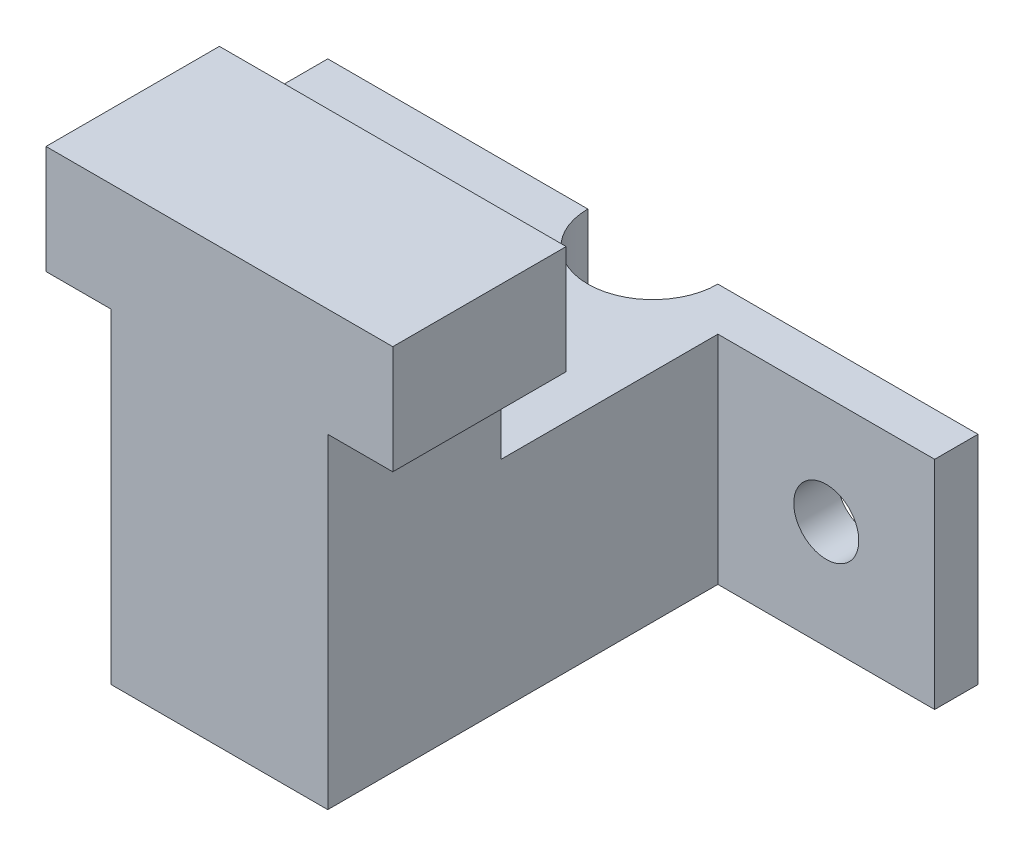
ISO-10303-21;
HEADER;
FILE_DESCRIPTION(('STEP AP214'),'2;1');
FILE_NAME('part.step','',(''),(''),'','','');
FILE_SCHEMA(('AUTOMOTIVE_DESIGN { 1 0 10303 214 1 1 1 1 }'));
ENDSEC;
DATA;
#1=APPLICATION_CONTEXT('core data for automotive mechanical design processes');
#2=APPLICATION_PROTOCOL_DEFINITION('international standard','automotive_design',2000,#1);
#3=PRODUCT_CONTEXT('',#1,'mechanical');
#4=PRODUCT('Part','Part','',(#3));
#5=PRODUCT_RELATED_PRODUCT_CATEGORY('part','',(#4));
#6=PRODUCT_DEFINITION_FORMATION('','',#4);
#7=PRODUCT_DEFINITION_CONTEXT('part definition',#1,'design');
#8=PRODUCT_DEFINITION('design','',#6,#7);
#9=PRODUCT_DEFINITION_SHAPE('','',#8);
#10=(LENGTH_UNIT() NAMED_UNIT(*) SI_UNIT(.MILLI.,.METRE.));
#11=(NAMED_UNIT(*) PLANE_ANGLE_UNIT() SI_UNIT($,.RADIAN.));
#12=(NAMED_UNIT(*) SI_UNIT($,.STERADIAN.) SOLID_ANGLE_UNIT());
#13=UNCERTAINTY_MEASURE_WITH_UNIT(LENGTH_MEASURE(1.E-05),#10,'distance_accuracy_value','');
#14=(GEOMETRIC_REPRESENTATION_CONTEXT(3) GLOBAL_UNCERTAINTY_ASSIGNED_CONTEXT((#13)) GLOBAL_UNIT_ASSIGNED_CONTEXT((#10,
#11,#12)) REPRESENTATION_CONTEXT('',''));
#15=CARTESIAN_POINT('',(0.,0.,0.));
#16=DIRECTION('',(0.,0.,1.));
#17=DIRECTION('',(1.,0.,0.));
#18=AXIS2_PLACEMENT_3D('',#15,#16,#17);
#19=CARTESIAN_POINT('',(-5.,-10.,0.));
#20=DIRECTION('',(1.,0.,0.));
#21=DIRECTION('',(0.,0.,-1.));
#22=AXIS2_PLACEMENT_3D('',#19,#20,#21);
#23=PLANE('',#22);
#24=DIRECTION('',(0.,1.,0.));
#25=VECTOR('',#24,1.);
#26=CARTESIAN_POINT('',(-5.,-10.,-10.));
#27=LINE('',#26,#25);
#28=CARTESIAN_POINT('',(-5.,-10.,-10.));
#29=VERTEX_POINT('',#28);
#30=CARTESIAN_POINT('',(-5.,0.,-10.));
#31=VERTEX_POINT('',#30);
#32=EDGE_CURVE('E173',#29,#31,#27,.T.);
#33=ORIENTED_EDGE('',*,*,#32,.F.);
#34=DIRECTION('',(0.,0.,1.));
#35=VECTOR('',#34,1.);
#36=CARTESIAN_POINT('',(-5.,-10.,0.));
#37=LINE('',#36,#35);
#38=CARTESIAN_POINT('',(-5.,-10.,8.));
#39=VERTEX_POINT('',#38);
#40=EDGE_CURVE('E225',#29,#39,#37,.T.);
#41=ORIENTED_EDGE('',*,*,#40,.T.);
#42=DIRECTION('',(0.,1.,0.));
#43=VECTOR('',#42,1.);
#44=CARTESIAN_POINT('',(-5.,-10.,8.));
#45=LINE('',#44,#43);
#46=CARTESIAN_POINT('',(-5.,5.,8.));
#47=VERTEX_POINT('',#46);
#48=EDGE_CURVE('E226',#39,#47,#45,.T.);
#49=ORIENTED_EDGE('',*,*,#48,.T.);
#50=DIRECTION('',(0.,0.,1.));
#51=VECTOR('',#50,1.);
#52=CARTESIAN_POINT('',(-5.,5.,0.));
#53=LINE('',#52,#51);
#54=CARTESIAN_POINT('',(-5.,5.,0.));
#55=VERTEX_POINT('',#54);
#56=EDGE_CURVE('E234',#55,#47,#53,.T.);
#57=ORIENTED_EDGE('',*,*,#56,.F.);
#58=DIRECTION('',(0.,1.,0.));
#59=VECTOR('',#58,1.);
#60=CARTESIAN_POINT('',(-5.,-10.,0.));
#61=LINE('',#60,#59);
#62=CARTESIAN_POINT('',(-5.,0.,0.));
#63=VERTEX_POINT('',#62);
#64=EDGE_CURVE('E219',#63,#55,#61,.T.);
#65=ORIENTED_EDGE('',*,*,#64,.F.);
#66=DIRECTION('',(0.,0.,1.));
#67=VECTOR('',#66,1.);
#68=CARTESIAN_POINT('',(-5.,0.,-12.));
#69=LINE('',#68,#67);
#70=EDGE_CURVE('E216',#31,#63,#69,.T.);
#71=ORIENTED_EDGE('',*,*,#70,.F.);
#72=EDGE_LOOP('',(#33,#41,#49,#57,#65,#71));
#73=FACE_BOUND('',#72,.T.);
#74=ADVANCED_FACE('F35',(#73),#23,.F.);
#75=CARTESIAN_POINT('',(5.,-10.,0.));
#76=DIRECTION('',(-1.,0.,0.));
#77=DIRECTION('',(0.,0.,1.));
#78=AXIS2_PLACEMENT_3D('',#75,#76,#77);
#79=PLANE('',#78);
#80=DIRECTION('',(0.,-1.,0.));
#81=VECTOR('',#80,1.);
#82=CARTESIAN_POINT('',(5.,-10.,-10.));
#83=LINE('',#82,#81);
#84=CARTESIAN_POINT('',(5.,0.,-10.));
#85=VERTEX_POINT('',#84);
#86=CARTESIAN_POINT('',(5.,-10.,-10.));
#87=VERTEX_POINT('',#86);
#88=EDGE_CURVE('E186',#85,#87,#83,.T.);
#89=ORIENTED_EDGE('',*,*,#88,.F.);
#90=DIRECTION('',(0.,0.,1.));
#91=VECTOR('',#90,1.);
#92=CARTESIAN_POINT('',(5.,0.,-12.));
#93=LINE('',#92,#91);
#94=CARTESIAN_POINT('',(5.,0.,0.));
#95=VERTEX_POINT('',#94);
#96=EDGE_CURVE('E212',#85,#95,#93,.T.);
#97=ORIENTED_EDGE('',*,*,#96,.T.);
#98=DIRECTION('',(0.,-1.,0.));
#99=VECTOR('',#98,1.);
#100=CARTESIAN_POINT('',(5.,-10.,0.));
#101=LINE('',#100,#99);
#102=CARTESIAN_POINT('',(5.,5.,0.));
#103=VERTEX_POINT('',#102);
#104=EDGE_CURVE('E240',#103,#95,#101,.T.);
#105=ORIENTED_EDGE('',*,*,#104,.F.);
#106=DIRECTION('',(0.,0.,1.));
#107=VECTOR('',#106,1.);
#108=CARTESIAN_POINT('',(5.,5.,0.));
#109=LINE('',#108,#107);
#110=CARTESIAN_POINT('',(5.,5.,8.));
#111=VERTEX_POINT('',#110);
#112=EDGE_CURVE('E249',#103,#111,#109,.T.);
#113=ORIENTED_EDGE('',*,*,#112,.T.);
#114=DIRECTION('',(0.,-1.,0.));
#115=VECTOR('',#114,1.);
#116=CARTESIAN_POINT('',(5.,-10.,8.));
#117=LINE('',#116,#115);
#118=CARTESIAN_POINT('',(5.,-10.,8.));
#119=VERTEX_POINT('',#118);
#120=EDGE_CURVE('E241',#111,#119,#117,.T.);
#121=ORIENTED_EDGE('',*,*,#120,.T.);
#122=DIRECTION('',(0.,0.,1.));
#123=VECTOR('',#122,1.);
#124=CARTESIAN_POINT('',(5.,-10.,0.));
#125=LINE('',#124,#123);
#126=EDGE_CURVE('E52',#87,#119,#125,.T.);
#127=ORIENTED_EDGE('',*,*,#126,.F.);
#128=EDGE_LOOP('',(#89,#97,#105,#113,#121,#127));
#129=FACE_BOUND('',#128,.T.);
#130=ADVANCED_FACE('F304',(#129),#79,.F.);
#131=CARTESIAN_POINT('',(0.,0.,-12.));
#132=DIRECTION('',(0.,0.,-1.));
#133=DIRECTION('',(-1.,0.,0.));
#134=AXIS2_PLACEMENT_3D('',#131,#132,#133);
#135=PLANE('',#134);
#136=CARTESIAN_POINT('',(10.,-5.,-12.));
#137=DIRECTION('',(0.,0.,-1.));
#138=DIRECTION('',(-1.,0.,0.));
#139=AXIS2_PLACEMENT_3D('',#136,#137,#138);
#140=CIRCLE('',#139,1.5);
#141=CARTESIAN_POINT('',(8.5,-5.,-12.));
#142=VERTEX_POINT('',#141);
#143=EDGE_CURVE('E276',#142,#142,#140,.T.);
#144=ORIENTED_EDGE('',*,*,#143,.F.);
#145=EDGE_LOOP('',(#144));
#146=FACE_BOUND('',#145,.T.);
#147=DIRECTION('',(0.,-1.,0.));
#148=VECTOR('',#147,1.);
#149=CARTESIAN_POINT('',(3.,4.,-12.));
#150=LINE('',#149,#148);
#151=CARTESIAN_POINT('',(3.,0.,-12.));
#152=VERTEX_POINT('',#151);
#153=CARTESIAN_POINT('',(3.,-10.,-12.));
#154=VERTEX_POINT('',#153);
#155=EDGE_CURVE('E11',#152,#154,#150,.T.);
#156=ORIENTED_EDGE('',*,*,#155,.F.);
#157=DIRECTION('',(1.,0.,0.));
#158=VECTOR('',#157,1.);
#159=CARTESIAN_POINT('',(-5.,0.,-12.));
#160=LINE('',#159,#158);
#161=CARTESIAN_POINT('',(15.,0.,-12.));
#162=VERTEX_POINT('',#161);
#163=EDGE_CURVE('E209',#152,#162,#160,.T.);
#164=ORIENTED_EDGE('',*,*,#163,.T.);
#165=DIRECTION('',(0.,1.,0.));
#166=VECTOR('',#165,1.);
#167=CARTESIAN_POINT('',(15.,-10.,-12.));
#168=LINE('',#167,#166);
#169=CARTESIAN_POINT('',(15.,-10.,-12.));
#170=VERTEX_POINT('',#169);
#171=EDGE_CURVE('E187',#170,#162,#168,.T.);
#172=ORIENTED_EDGE('',*,*,#171,.F.);
#173=DIRECTION('',(-1.,0.,0.));
#174=VECTOR('',#173,1.);
#175=CARTESIAN_POINT('',(-5.,-10.,-12.));
#176=LINE('',#175,#174);
#177=EDGE_CURVE('E157',#170,#154,#176,.T.);
#178=ORIENTED_EDGE('',*,*,#177,.T.);
#179=EDGE_LOOP('',(#156,#164,#172,#178));
#180=FACE_BOUND('',#179,.T.);
#181=ADVANCED_FACE('F293',(#146,#180),#135,.T.);
#182=CARTESIAN_POINT('',(8.,-10.,8.));
#183=DIRECTION('',(-1.,0.,0.));
#184=DIRECTION('',(0.,0.,1.));
#185=AXIS2_PLACEMENT_3D('',#182,#183,#184);
#186=PLANE('',#185);
#187=DIRECTION('',(0.,1.,0.));
#188=VECTOR('',#187,1.);
#189=CARTESIAN_POINT('',(8.,-10.,8.));
#190=LINE('',#189,#188);
#191=CARTESIAN_POINT('',(8.,5.,8.));
#192=VERTEX_POINT('',#191);
#193=CARTESIAN_POINT('',(8.,10.,8.));
#194=VERTEX_POINT('',#193);
#195=EDGE_CURVE('E252',#192,#194,#190,.T.);
#196=ORIENTED_EDGE('',*,*,#195,.F.);
#197=DIRECTION('',(0.,0.,1.));
#198=VECTOR('',#197,1.);
#199=CARTESIAN_POINT('',(8.,5.,0.));
#200=LINE('',#199,#198);
#201=CARTESIAN_POINT('',(8.,5.,0.));
#202=VERTEX_POINT('',#201);
#203=EDGE_CURVE('E244',#202,#192,#200,.T.);
#204=ORIENTED_EDGE('',*,*,#203,.F.);
#205=DIRECTION('',(0.,1.,0.));
#206=VECTOR('',#205,1.);
#207=CARTESIAN_POINT('',(8.,-10.,0.));
#208=LINE('',#207,#206);
#209=CARTESIAN_POINT('',(8.,10.,0.));
#210=VERTEX_POINT('',#209);
#211=EDGE_CURVE('E233',#202,#210,#208,.T.);
#212=ORIENTED_EDGE('',*,*,#211,.T.);
#213=DIRECTION('',(0.,0.,-1.));
#214=VECTOR('',#213,1.);
#215=CARTESIAN_POINT('',(8.,10.,8.));
#216=LINE('',#215,#214);
#217=EDGE_CURVE('E271',#194,#210,#216,.T.);
#218=ORIENTED_EDGE('',*,*,#217,.F.);
#219=EDGE_LOOP('',(#196,#204,#212,#218));
#220=FACE_BOUND('',#219,.T.);
#221=ADVANCED_FACE('F37',(#220),#186,.F.);
#222=CARTESIAN_POINT('',(-8.,10.,8.));
#223=DIRECTION('',(0.,-1.,0.));
#224=DIRECTION('',(0.,0.,-1.));
#225=AXIS2_PLACEMENT_3D('',#222,#223,#224);
#226=PLANE('',#225);
#227=DIRECTION('',(-1.,0.,0.));
#228=VECTOR('',#227,1.);
#229=CARTESIAN_POINT('',(-8.,10.,0.));
#230=LINE('',#229,#228);
#231=CARTESIAN_POINT('',(-8.,10.,0.));
#232=VERTEX_POINT('',#231);
#233=EDGE_CURVE('E265',#210,#232,#230,.T.);
#234=ORIENTED_EDGE('',*,*,#233,.T.);
#235=DIRECTION('',(0.,0.,-1.));
#236=VECTOR('',#235,1.);
#237=CARTESIAN_POINT('',(-8.,10.,8.));
#238=LINE('',#237,#236);
#239=CARTESIAN_POINT('',(-8.,10.,8.));
#240=VERTEX_POINT('',#239);
#241=EDGE_CURVE('E263',#240,#232,#238,.T.);
#242=ORIENTED_EDGE('',*,*,#241,.F.);
#243=DIRECTION('',(-1.,0.,0.));
#244=VECTOR('',#243,1.);
#245=CARTESIAN_POINT('',(-8.,10.,8.));
#246=LINE('',#245,#244);
#247=EDGE_CURVE('E254',#194,#240,#246,.T.);
#248=ORIENTED_EDGE('',*,*,#247,.F.);
#249=ORIENTED_EDGE('',*,*,#217,.T.);
#250=EDGE_LOOP('',(#234,#242,#248,#249));
#251=FACE_BOUND('',#250,.T.);
#252=ADVANCED_FACE('F332',(#251),#226,.F.);
#253=CARTESIAN_POINT('',(-8.,-10.,8.));
#254=DIRECTION('',(1.,0.,0.));
#255=DIRECTION('',(0.,0.,-1.));
#256=AXIS2_PLACEMENT_3D('',#253,#254,#255);
#257=PLANE('',#256);
#258=DIRECTION('',(0.,-1.,0.));
#259=VECTOR('',#258,1.);
#260=CARTESIAN_POINT('',(-8.,-10.,0.));
#261=LINE('',#260,#259);
#262=CARTESIAN_POINT('',(-8.,5.,0.));
#263=VERTEX_POINT('',#262);
#264=EDGE_CURVE('E255',#232,#263,#261,.T.);
#265=ORIENTED_EDGE('',*,*,#264,.T.);
#266=DIRECTION('',(0.,0.,1.));
#267=VECTOR('',#266,1.);
#268=CARTESIAN_POINT('',(-8.,5.,0.));
#269=LINE('',#268,#267);
#270=CARTESIAN_POINT('',(-8.,5.,8.));
#271=VERTEX_POINT('',#270);
#272=EDGE_CURVE('E230',#263,#271,#269,.T.);
#273=ORIENTED_EDGE('',*,*,#272,.T.);
#274=DIRECTION('',(0.,-1.,0.));
#275=VECTOR('',#274,1.);
#276=CARTESIAN_POINT('',(-8.,-10.,8.));
#277=LINE('',#276,#275);
#278=EDGE_CURVE('E257',#240,#271,#277,.T.);
#279=ORIENTED_EDGE('',*,*,#278,.F.);
#280=ORIENTED_EDGE('',*,*,#241,.T.);
#281=EDGE_LOOP('',(#265,#273,#279,#280));
#282=FACE_BOUND('',#281,.T.);
#283=ADVANCED_FACE('F330',(#282),#257,.F.);
#284=CARTESIAN_POINT('',(-8.,-10.,8.));
#285=DIRECTION('',(0.,1.,0.));
#286=DIRECTION('',(0.,0.,1.));
#287=AXIS2_PLACEMENT_3D('',#284,#285,#286);
#288=PLANE('',#287);
#289=CARTESIAN_POINT('',(-3.,-10.,-12.));
#290=VERTEX_POINT('',#289);
#291=CARTESIAN_POINT('',(-15.,-10.,-12.));
#292=VERTEX_POINT('',#291);
#293=EDGE_CURVE('E150',#290,#292,#176,.T.);
#294=ORIENTED_EDGE('',*,*,#293,.F.);
#295=CARTESIAN_POINT('',(0.,-10.,-12.));
#296=DIRECTION('',(0.,-1.,0.));
#297=DIRECTION('',(0.,0.,-1.));
#298=AXIS2_PLACEMENT_3D('',#295,#296,#297);
#299=CIRCLE('',#298,3.);
#300=EDGE_CURVE('E59',#154,#290,#299,.T.);
#301=ORIENTED_EDGE('',*,*,#300,.F.);
#302=ORIENTED_EDGE('',*,*,#177,.F.);
#303=DIRECTION('',(0.,0.,-1.));
#304=VECTOR('',#303,1.);
#305=CARTESIAN_POINT('',(15.,-10.,-12.));
#306=LINE('',#305,#304);
#307=CARTESIAN_POINT('',(15.,-10.,-10.));
#308=VERTEX_POINT('',#307);
#309=EDGE_CURVE('E194',#308,#170,#306,.T.);
#310=ORIENTED_EDGE('',*,*,#309,.F.);
#311=DIRECTION('',(-1.,0.,0.));
#312=VECTOR('',#311,1.);
#313=CARTESIAN_POINT('',(15.,-10.,-10.));
#314=LINE('',#313,#312);
#315=EDGE_CURVE('E197',#308,#87,#314,.T.);
#316=ORIENTED_EDGE('',*,*,#315,.T.);
#317=ORIENTED_EDGE('',*,*,#126,.T.);
#318=DIRECTION('',(1.,0.,0.));
#319=VECTOR('',#318,1.);
#320=CARTESIAN_POINT('',(-8.,-10.,8.));
#321=LINE('',#320,#319);
#322=EDGE_CURVE('E260',#39,#119,#321,.T.);
#323=ORIENTED_EDGE('',*,*,#322,.F.);
#324=ORIENTED_EDGE('',*,*,#40,.F.);
#325=DIRECTION('',(1.,0.,0.));
#326=VECTOR('',#325,1.);
#327=CARTESIAN_POINT('',(-15.,-10.,-10.));
#328=LINE('',#327,#326);
#329=CARTESIAN_POINT('',(-15.,-10.,-10.));
#330=VERTEX_POINT('',#329);
#331=EDGE_CURVE('E164',#330,#29,#328,.T.);
#332=ORIENTED_EDGE('',*,*,#331,.F.);
#333=DIRECTION('',(0.,0.,1.));
#334=VECTOR('',#333,1.);
#335=CARTESIAN_POINT('',(-15.,-10.,-12.));
#336=LINE('',#335,#334);
#337=EDGE_CURVE('E161',#292,#330,#336,.T.);
#338=ORIENTED_EDGE('',*,*,#337,.F.);
#339=EDGE_LOOP('',(#294,#301,#302,#310,#316,#317,#323,#324,#332,#338));
#340=FACE_BOUND('',#339,.T.);
#341=ADVANCED_FACE('F162',(#340),#288,.F.);
#342=CARTESIAN_POINT('',(0.,0.,8.));
#343=DIRECTION('',(0.,0.,-1.));
#344=DIRECTION('',(-1.,0.,0.));
#345=AXIS2_PLACEMENT_3D('',#342,#343,#344);
#346=PLANE('',#345);
#347=ORIENTED_EDGE('',*,*,#278,.T.);
#348=DIRECTION('',(-1.,0.,0.));
#349=VECTOR('',#348,1.);
#350=CARTESIAN_POINT('',(-8.,5.,8.));
#351=LINE('',#350,#349);
#352=EDGE_CURVE('E222',#47,#271,#351,.T.);
#353=ORIENTED_EDGE('',*,*,#352,.F.);
#354=ORIENTED_EDGE('',*,*,#48,.F.);
#355=ORIENTED_EDGE('',*,*,#322,.T.);
#356=ORIENTED_EDGE('',*,*,#120,.F.);
#357=DIRECTION('',(-1.,0.,0.));
#358=VECTOR('',#357,1.);
#359=CARTESIAN_POINT('',(8.,5.,8.));
#360=LINE('',#359,#358);
#361=EDGE_CURVE('E218',#192,#111,#360,.T.);
#362=ORIENTED_EDGE('',*,*,#361,.F.);
#363=ORIENTED_EDGE('',*,*,#195,.T.);
#364=ORIENTED_EDGE('',*,*,#247,.T.);
#365=EDGE_LOOP('',(#347,#353,#354,#355,#356,#362,#363,#364));
#366=FACE_BOUND('',#365,.T.);
#367=ADVANCED_FACE('F321',(#366),#346,.F.);
#368=CARTESIAN_POINT('',(0.,0.,0.));
#369=DIRECTION('',(0.,0.,-1.));
#370=DIRECTION('',(-1.,0.,0.));
#371=AXIS2_PLACEMENT_3D('',#368,#369,#370);
#372=PLANE('',#371);
#373=DIRECTION('',(1.,0.,0.));
#374=VECTOR('',#373,1.);
#375=CARTESIAN_POINT('',(-5.,0.,0.));
#376=LINE('',#375,#374);
#377=EDGE_CURVE('E208',#63,#95,#376,.T.);
#378=ORIENTED_EDGE('',*,*,#377,.F.);
#379=ORIENTED_EDGE('',*,*,#64,.T.);
#380=DIRECTION('',(-1.,0.,0.));
#381=VECTOR('',#380,1.);
#382=CARTESIAN_POINT('',(-8.,5.,0.));
#383=LINE('',#382,#381);
#384=EDGE_CURVE('E221',#55,#263,#383,.T.);
#385=ORIENTED_EDGE('',*,*,#384,.T.);
#386=ORIENTED_EDGE('',*,*,#264,.F.);
#387=ORIENTED_EDGE('',*,*,#233,.F.);
#388=ORIENTED_EDGE('',*,*,#211,.F.);
#389=DIRECTION('',(-1.,0.,0.));
#390=VECTOR('',#389,1.);
#391=CARTESIAN_POINT('',(8.,5.,0.));
#392=LINE('',#391,#390);
#393=EDGE_CURVE('E237',#202,#103,#392,.T.);
#394=ORIENTED_EDGE('',*,*,#393,.T.);
#395=ORIENTED_EDGE('',*,*,#104,.T.);
#396=EDGE_LOOP('',(#378,#379,#385,#386,#387,#388,#394,#395));
#397=FACE_BOUND('',#396,.T.);
#398=ADVANCED_FACE('F319',(#397),#372,.T.);
#399=CARTESIAN_POINT('',(8.,5.,0.));
#400=DIRECTION('',(0.,1.,0.));
#401=DIRECTION('',(0.,0.,1.));
#402=AXIS2_PLACEMENT_3D('',#399,#400,#401);
#403=PLANE('',#402);
#404=ORIENTED_EDGE('',*,*,#361,.T.);
#405=ORIENTED_EDGE('',*,*,#112,.F.);
#406=ORIENTED_EDGE('',*,*,#393,.F.);
#407=ORIENTED_EDGE('',*,*,#203,.T.);
#408=EDGE_LOOP('',(#404,#405,#406,#407));
#409=FACE_BOUND('',#408,.T.);
#410=ADVANCED_FACE('F316',(#409),#403,.F.);
#411=CARTESIAN_POINT('',(-8.,5.,0.));
#412=DIRECTION('',(0.,1.,0.));
#413=DIRECTION('',(0.,0.,1.));
#414=AXIS2_PLACEMENT_3D('',#411,#412,#413);
#415=PLANE('',#414);
#416=ORIENTED_EDGE('',*,*,#352,.T.);
#417=ORIENTED_EDGE('',*,*,#272,.F.);
#418=ORIENTED_EDGE('',*,*,#384,.F.);
#419=ORIENTED_EDGE('',*,*,#56,.T.);
#420=EDGE_LOOP('',(#416,#417,#418,#419));
#421=FACE_BOUND('',#420,.T.);
#422=ADVANCED_FACE('F300',(#421),#415,.F.);
#423=CARTESIAN_POINT('',(-5.,0.,-12.));
#424=DIRECTION('',(0.,-1.,0.));
#425=DIRECTION('',(1.,0.,0.));
#426=AXIS2_PLACEMENT_3D('',#423,#424,#425);
#427=PLANE('',#426);
#428=ORIENTED_EDGE('',*,*,#163,.F.);
#429=CARTESIAN_POINT('',(0.,0.,-12.));
#430=DIRECTION('',(0.,-1.,0.));
#431=DIRECTION('',(1.,0.,0.));
#432=AXIS2_PLACEMENT_3D('',#429,#430,#431);
#433=CIRCLE('',#432,3.);
#434=CARTESIAN_POINT('',(-3.,0.,-12.));
#435=VERTEX_POINT('',#434);
#436=EDGE_CURVE('E205',#152,#435,#433,.T.);
#437=ORIENTED_EDGE('',*,*,#436,.T.);
#438=CARTESIAN_POINT('',(-15.,0.,-12.));
#439=VERTEX_POINT('',#438);
#440=EDGE_CURVE('E158',#439,#435,#160,.T.);
#441=ORIENTED_EDGE('',*,*,#440,.F.);
#442=DIRECTION('',(0.,0.,-1.));
#443=VECTOR('',#442,1.);
#444=CARTESIAN_POINT('',(-15.,0.,-12.));
#445=LINE('',#444,#443);
#446=CARTESIAN_POINT('',(-15.,0.,-10.));
#447=VERTEX_POINT('',#446);
#448=EDGE_CURVE('E172',#447,#439,#445,.T.);
#449=ORIENTED_EDGE('',*,*,#448,.F.);
#450=DIRECTION('',(1.,0.,0.));
#451=VECTOR('',#450,1.);
#452=CARTESIAN_POINT('',(-15.,0.,-10.));
#453=LINE('',#452,#451);
#454=EDGE_CURVE('E181',#447,#31,#453,.T.);
#455=ORIENTED_EDGE('',*,*,#454,.T.);
#456=ORIENTED_EDGE('',*,*,#70,.T.);
#457=ORIENTED_EDGE('',*,*,#377,.T.);
#458=ORIENTED_EDGE('',*,*,#96,.F.);
#459=DIRECTION('',(-1.,0.,0.));
#460=VECTOR('',#459,1.);
#461=CARTESIAN_POINT('',(15.,0.,-10.));
#462=LINE('',#461,#460);
#463=CARTESIAN_POINT('',(15.,0.,-10.));
#464=VERTEX_POINT('',#463);
#465=EDGE_CURVE('E201',#464,#85,#462,.T.);
#466=ORIENTED_EDGE('',*,*,#465,.F.);
#467=DIRECTION('',(0.,0.,1.));
#468=VECTOR('',#467,1.);
#469=CARTESIAN_POINT('',(15.,0.,-12.));
#470=LINE('',#469,#468);
#471=EDGE_CURVE('E190',#162,#464,#470,.T.);
#472=ORIENTED_EDGE('',*,*,#471,.F.);
#473=EDGE_LOOP('',(#428,#437,#441,#449,#455,#456,#457,#458,#466,#472));
#474=FACE_BOUND('',#473,.T.);
#475=ADVANCED_FACE('F291',(#474),#427,.F.);
#476=CARTESIAN_POINT('',(-10.,-5.,-12.));
#477=DIRECTION('',(0.,0.,-1.));
#478=DIRECTION('',(-1.,0.,0.));
#479=AXIS2_PLACEMENT_3D('',#476,#477,#478);
#480=CIRCLE('',#479,1.5);
#481=CARTESIAN_POINT('',(-11.5,-5.,-12.));
#482=VERTEX_POINT('',#481);
#483=EDGE_CURVE('E177',#482,#482,#480,.T.);
#484=ORIENTED_EDGE('',*,*,#483,.F.);
#485=EDGE_LOOP('',(#484));
#486=FACE_BOUND('',#485,.T.);
#487=DIRECTION('',(0.,-1.,0.));
#488=VECTOR('',#487,1.);
#489=CARTESIAN_POINT('',(-3.,4.,-12.));
#490=LINE('',#489,#488);
#491=EDGE_CURVE('E44',#290,#435,#490,.F.);
#492=ORIENTED_EDGE('',*,*,#491,.F.);
#493=ORIENTED_EDGE('',*,*,#293,.T.);
#494=DIRECTION('',(0.,-1.,0.));
#495=VECTOR('',#494,1.);
#496=CARTESIAN_POINT('',(-15.,-10.,-12.));
#497=LINE('',#496,#495);
#498=EDGE_CURVE('E155',#439,#292,#497,.T.);
#499=ORIENTED_EDGE('',*,*,#498,.F.);
#500=ORIENTED_EDGE('',*,*,#440,.T.);
#501=EDGE_LOOP('',(#492,#493,#499,#500));
#502=FACE_BOUND('',#501,.T.);
#503=ADVANCED_FACE('F152',(#486,#502),#135,.T.);
#504=CARTESIAN_POINT('',(0.,4.,-12.));
#505=DIRECTION('',(0.,-1.,0.));
#506=DIRECTION('',(0.,0.,-1.));
#507=AXIS2_PLACEMENT_3D('',#504,#505,#506);
#508=CYLINDRICAL_SURFACE('',#507,3.);
#509=ORIENTED_EDGE('',*,*,#155,.T.);
#510=ORIENTED_EDGE('',*,*,#300,.T.);
#511=ORIENTED_EDGE('',*,*,#491,.T.);
#512=ORIENTED_EDGE('',*,*,#436,.F.);
#513=EDGE_LOOP('',(#509,#510,#511,#512));
#514=FACE_BOUND('',#513,.T.);
#515=ADVANCED_FACE('F290',(#514),#508,.F.);
#516=CARTESIAN_POINT('',(15.,-10.,-10.));
#517=DIRECTION('',(0.,0.,-1.));
#518=DIRECTION('',(-1.,0.,0.));
#519=AXIS2_PLACEMENT_3D('',#516,#517,#518);
#520=PLANE('',#519);
#521=CARTESIAN_POINT('',(10.,-5.,-10.));
#522=DIRECTION('',(0.,0.,-1.));
#523=DIRECTION('',(-1.,0.,0.));
#524=AXIS2_PLACEMENT_3D('',#521,#522,#523);
#525=CIRCLE('',#524,1.5);
#526=CARTESIAN_POINT('',(8.5,-5.,-10.));
#527=VERTEX_POINT('',#526);
#528=EDGE_CURVE('E39',#527,#527,#525,.T.);
#529=ORIENTED_EDGE('',*,*,#528,.T.);
#530=EDGE_LOOP('',(#529));
#531=FACE_BOUND('',#530,.T.);
#532=ORIENTED_EDGE('',*,*,#88,.T.);
#533=ORIENTED_EDGE('',*,*,#315,.F.);
#534=DIRECTION('',(0.,-1.,0.));
#535=VECTOR('',#534,1.);
#536=CARTESIAN_POINT('',(15.,-10.,-10.));
#537=LINE('',#536,#535);
#538=EDGE_CURVE('E192',#464,#308,#537,.T.);
#539=ORIENTED_EDGE('',*,*,#538,.F.);
#540=ORIENTED_EDGE('',*,*,#465,.T.);
#541=EDGE_LOOP('',(#532,#533,#539,#540));
#542=FACE_BOUND('',#541,.T.);
#543=ADVANCED_FACE('F298',(#531,#542),#520,.F.);
#544=CARTESIAN_POINT('',(15.,0.,0.));
#545=DIRECTION('',(1.,0.,0.));
#546=DIRECTION('',(0.,0.,-1.));
#547=AXIS2_PLACEMENT_3D('',#544,#545,#546);
#548=PLANE('',#547);
#549=ORIENTED_EDGE('',*,*,#171,.T.);
#550=ORIENTED_EDGE('',*,*,#471,.T.);
#551=ORIENTED_EDGE('',*,*,#538,.T.);
#552=ORIENTED_EDGE('',*,*,#309,.T.);
#553=EDGE_LOOP('',(#549,#550,#551,#552));
#554=FACE_BOUND('',#553,.T.);
#555=ADVANCED_FACE('F371',(#554),#548,.T.);
#556=CARTESIAN_POINT('',(-15.,-10.,-10.));
#557=DIRECTION('',(0.,0.,-1.));
#558=DIRECTION('',(-1.,0.,0.));
#559=AXIS2_PLACEMENT_3D('',#556,#557,#558);
#560=PLANE('',#559);
#561=CARTESIAN_POINT('',(-10.,-5.,-10.));
#562=DIRECTION('',(0.,0.,-1.));
#563=DIRECTION('',(-1.,0.,0.));
#564=AXIS2_PLACEMENT_3D('',#561,#562,#563);
#565=CIRCLE('',#564,1.5);
#566=CARTESIAN_POINT('',(-11.5,-5.,-10.));
#567=VERTEX_POINT('',#566);
#568=EDGE_CURVE('E274',#567,#567,#565,.T.);
#569=ORIENTED_EDGE('',*,*,#568,.T.);
#570=EDGE_LOOP('',(#569));
#571=FACE_BOUND('',#570,.T.);
#572=ORIENTED_EDGE('',*,*,#32,.T.);
#573=ORIENTED_EDGE('',*,*,#454,.F.);
#574=DIRECTION('',(0.,1.,0.));
#575=VECTOR('',#574,1.);
#576=CARTESIAN_POINT('',(-15.,-10.,-10.));
#577=LINE('',#576,#575);
#578=EDGE_CURVE('E167',#330,#447,#577,.T.);
#579=ORIENTED_EDGE('',*,*,#578,.F.);
#580=ORIENTED_EDGE('',*,*,#331,.T.);
#581=EDGE_LOOP('',(#572,#573,#579,#580));
#582=FACE_BOUND('',#581,.T.);
#583=ADVANCED_FACE('F376',(#571,#582),#560,.F.);
#584=CARTESIAN_POINT('',(-15.,0.,0.));
#585=DIRECTION('',(1.,0.,0.));
#586=DIRECTION('',(0.,0.,-1.));
#587=AXIS2_PLACEMENT_3D('',#584,#585,#586);
#588=PLANE('',#587);
#589=ORIENTED_EDGE('',*,*,#498,.T.);
#590=ORIENTED_EDGE('',*,*,#337,.T.);
#591=ORIENTED_EDGE('',*,*,#578,.T.);
#592=ORIENTED_EDGE('',*,*,#448,.T.);
#593=EDGE_LOOP('',(#589,#590,#591,#592));
#594=FACE_BOUND('',#593,.T.);
#595=ADVANCED_FACE('F170',(#594),#588,.F.);
#596=CARTESIAN_POINT('',(-10.,-5.,-2.));
#597=DIRECTION('',(0.,0.,-1.));
#598=DIRECTION('',(-1.,0.,0.));
#599=AXIS2_PLACEMENT_3D('',#596,#597,#598);
#600=CYLINDRICAL_SURFACE('',#599,1.5);
#601=ORIENTED_EDGE('',*,*,#483,.T.);
#602=EDGE_LOOP('',(#601));
#603=FACE_BOUND('',#602,.T.);
#604=ORIENTED_EDGE('',*,*,#568,.F.);
#605=EDGE_LOOP('',(#604));
#606=FACE_BOUND('',#605,.T.);
#607=ADVANCED_FACE('F286',(#603,#606),#600,.F.);
#608=CARTESIAN_POINT('',(10.,-5.,-2.));
#609=DIRECTION('',(0.,0.,-1.));
#610=DIRECTION('',(-1.,0.,0.));
#611=AXIS2_PLACEMENT_3D('',#608,#609,#610);
#612=CYLINDRICAL_SURFACE('',#611,1.5);
#613=ORIENTED_EDGE('',*,*,#143,.T.);
#614=EDGE_LOOP('',(#613));
#615=FACE_BOUND('',#614,.T.);
#616=ORIENTED_EDGE('',*,*,#528,.F.);
#617=EDGE_LOOP('',(#616));
#618=FACE_BOUND('',#617,.T.);
#619=ADVANCED_FACE('F390',(#615,#618),#612,.F.);
#620=CLOSED_SHELL('',(#74,#130,#181,#221,#252,#283,#341,#367,#398,#410,#422,#475,#503,#515,#543,
#555,#583,#595,#607,#619));
#621=MANIFOLD_SOLID_BREP('B2',#620);
#622=ADVANCED_BREP_SHAPE_REPRESENTATION('',(#18,#621),#14);
#623=SHAPE_DEFINITION_REPRESENTATION(#9,#622);
ENDSEC;
END-ISO-10303-21;
